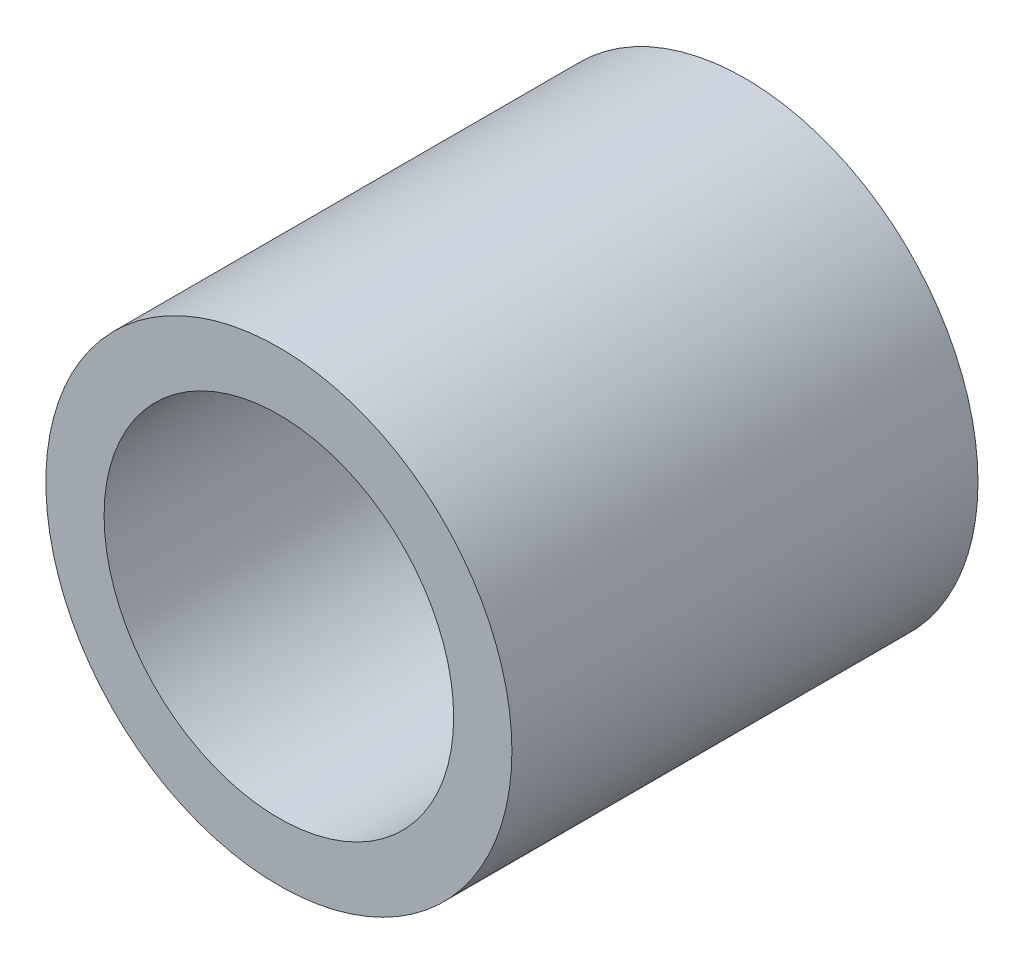
ISO-10303-21;
HEADER;
FILE_DESCRIPTION(('STEP AP214'),'2;1');
FILE_NAME('part.step','',(''),(''),'','','');
FILE_SCHEMA(('AUTOMOTIVE_DESIGN { 1 0 10303 214 1 1 1 1 }'));
ENDSEC;
DATA;
#1=APPLICATION_CONTEXT('core data for automotive mechanical design processes');
#2=APPLICATION_PROTOCOL_DEFINITION('international standard','automotive_design',2000,#1);
#3=PRODUCT_CONTEXT('',#1,'mechanical');
#4=PRODUCT('Part','Part','',(#3));
#5=PRODUCT_RELATED_PRODUCT_CATEGORY('part','',(#4));
#6=PRODUCT_DEFINITION_FORMATION('','',#4);
#7=PRODUCT_DEFINITION_CONTEXT('part definition',#1,'design');
#8=PRODUCT_DEFINITION('design','',#6,#7);
#9=PRODUCT_DEFINITION_SHAPE('','',#8);
#10=(LENGTH_UNIT() NAMED_UNIT(*) SI_UNIT(.MILLI.,.METRE.));
#11=(NAMED_UNIT(*) PLANE_ANGLE_UNIT() SI_UNIT($,.RADIAN.));
#12=(NAMED_UNIT(*) SI_UNIT($,.STERADIAN.) SOLID_ANGLE_UNIT());
#13=UNCERTAINTY_MEASURE_WITH_UNIT(LENGTH_MEASURE(1.E-05),#10,'distance_accuracy_value','');
#14=(GEOMETRIC_REPRESENTATION_CONTEXT(3) GLOBAL_UNCERTAINTY_ASSIGNED_CONTEXT((#13)) GLOBAL_UNIT_ASSIGNED_CONTEXT((#10,
#11,#12)) REPRESENTATION_CONTEXT('',''));
#15=CARTESIAN_POINT('',(0.,0.,0.));
#16=DIRECTION('',(0.,0.,1.));
#17=DIRECTION('',(1.,0.,0.));
#18=AXIS2_PLACEMENT_3D('',#15,#16,#17);
#19=CARTESIAN_POINT('',(0.,0.,10.));
#20=DIRECTION('',(0.,0.,1.));
#21=DIRECTION('',(1.,0.,0.));
#22=AXIS2_PLACEMENT_3D('',#19,#20,#21);
#23=PLANE('',#22);
#24=CARTESIAN_POINT('',(0.,0.,10.));
#25=DIRECTION('',(0.,0.,1.));
#26=DIRECTION('',(1.,0.,0.));
#27=AXIS2_PLACEMENT_3D('',#24,#25,#26);
#28=CIRCLE('',#27,5.);
#29=CARTESIAN_POINT('',(5.,0.,10.));
#30=VERTEX_POINT('',#29);
#31=EDGE_CURVE('E10',#30,#30,#28,.T.);
#32=ORIENTED_EDGE('',*,*,#31,.T.);
#33=EDGE_LOOP('',(#32));
#34=FACE_BOUND('',#33,.T.);
#35=CARTESIAN_POINT('',(0.,0.,10.));
#36=DIRECTION('',(0.,0.,1.));
#37=DIRECTION('',(1.,0.,0.));
#38=AXIS2_PLACEMENT_3D('',#35,#36,#37);
#39=CIRCLE('',#38,3.75);
#40=CARTESIAN_POINT('',(3.75,0.,10.));
#41=VERTEX_POINT('',#40);
#42=EDGE_CURVE('E48',#41,#41,#39,.T.);
#43=ORIENTED_EDGE('',*,*,#42,.F.);
#44=EDGE_LOOP('',(#43));
#45=FACE_BOUND('',#44,.T.);
#46=ADVANCED_FACE('F37',(#34,#45),#23,.T.);
#47=CARTESIAN_POINT('',(0.,0.,0.));
#48=DIRECTION('',(0.,0.,1.));
#49=DIRECTION('',(1.,0.,0.));
#50=AXIS2_PLACEMENT_3D('',#47,#48,#49);
#51=PLANE('',#50);
#52=CARTESIAN_POINT('',(0.,0.,0.));
#53=DIRECTION('',(0.,0.,1.));
#54=DIRECTION('',(1.,0.,0.));
#55=AXIS2_PLACEMENT_3D('',#52,#53,#54);
#56=CIRCLE('',#55,5.);
#57=CARTESIAN_POINT('',(5.,0.,0.));
#58=VERTEX_POINT('',#57);
#59=EDGE_CURVE('E41',#58,#58,#56,.T.);
#60=ORIENTED_EDGE('',*,*,#59,.F.);
#61=EDGE_LOOP('',(#60));
#62=FACE_BOUND('',#61,.T.);
#63=CARTESIAN_POINT('',(0.,0.,0.));
#64=DIRECTION('',(0.,0.,1.));
#65=DIRECTION('',(1.,0.,0.));
#66=AXIS2_PLACEMENT_3D('',#63,#64,#65);
#67=CIRCLE('',#66,3.75);
#68=CARTESIAN_POINT('',(3.75,0.,0.));
#69=VERTEX_POINT('',#68);
#70=EDGE_CURVE('E50',#69,#69,#67,.T.);
#71=ORIENTED_EDGE('',*,*,#70,.T.);
#72=EDGE_LOOP('',(#71));
#73=FACE_BOUND('',#72,.T.);
#74=ADVANCED_FACE('F60',(#62,#73),#51,.F.);
#75=CARTESIAN_POINT('',(0.,0.,10.));
#76=DIRECTION('',(0.,0.,-1.));
#77=DIRECTION('',(-1.,0.,0.));
#78=AXIS2_PLACEMENT_3D('',#75,#76,#77);
#79=CYLINDRICAL_SURFACE('',#78,5.);
#80=ORIENTED_EDGE('',*,*,#31,.F.);
#81=EDGE_LOOP('',(#80));
#82=FACE_BOUND('',#81,.T.);
#83=ORIENTED_EDGE('',*,*,#59,.T.);
#84=EDGE_LOOP('',(#83));
#85=FACE_BOUND('',#84,.T.);
#86=ADVANCED_FACE('F39',(#82,#85),#79,.T.);
#87=CARTESIAN_POINT('',(0.,0.,10.));
#88=DIRECTION('',(0.,0.,-1.));
#89=DIRECTION('',(-1.,0.,0.));
#90=AXIS2_PLACEMENT_3D('',#87,#88,#89);
#91=CYLINDRICAL_SURFACE('',#90,3.75);
#92=ORIENTED_EDGE('',*,*,#42,.T.);
#93=EDGE_LOOP('',(#92));
#94=FACE_BOUND('',#93,.T.);
#95=ORIENTED_EDGE('',*,*,#70,.F.);
#96=EDGE_LOOP('',(#95));
#97=FACE_BOUND('',#96,.T.);
#98=ADVANCED_FACE('F56',(#94,#97),#91,.F.);
#99=CLOSED_SHELL('',(#46,#74,#86,#98));
#100=MANIFOLD_SOLID_BREP('B2',#99);
#101=ADVANCED_BREP_SHAPE_REPRESENTATION('',(#18,#100),#14);
#102=SHAPE_DEFINITION_REPRESENTATION(#9,#101);
ENDSEC;
END-ISO-10303-21;
